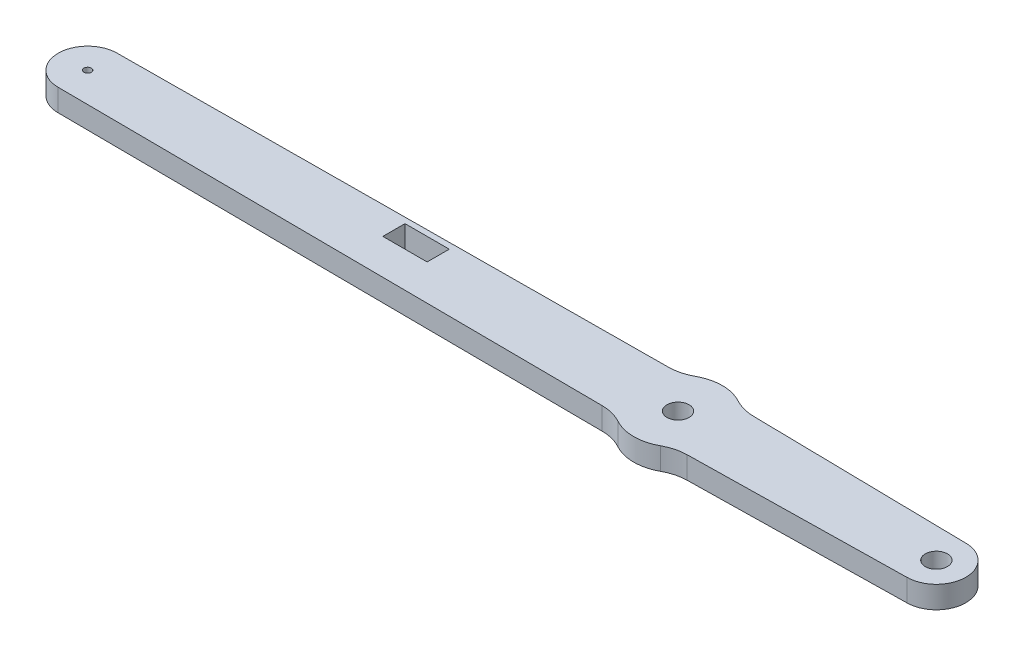
ISO-10303-21;
HEADER;
FILE_DESCRIPTION(('STEP AP214'),'2;1');
FILE_NAME('part.step','',(''),(''),'','','');
FILE_SCHEMA(('AUTOMOTIVE_DESIGN { 1 0 10303 214 1 1 1 1 }'));
ENDSEC;
DATA;
#1=APPLICATION_CONTEXT('core data for automotive mechanical design processes');
#2=APPLICATION_PROTOCOL_DEFINITION('international standard','automotive_design',2000,#1);
#3=PRODUCT_CONTEXT('',#1,'mechanical');
#4=PRODUCT('Part','Part','',(#3));
#5=PRODUCT_RELATED_PRODUCT_CATEGORY('part','',(#4));
#6=PRODUCT_DEFINITION_FORMATION('','',#4);
#7=PRODUCT_DEFINITION_CONTEXT('part definition',#1,'design');
#8=PRODUCT_DEFINITION('design','',#6,#7);
#9=PRODUCT_DEFINITION_SHAPE('','',#8);
#10=(LENGTH_UNIT() NAMED_UNIT(*) SI_UNIT(.MILLI.,.METRE.));
#11=(NAMED_UNIT(*) PLANE_ANGLE_UNIT() SI_UNIT($,.RADIAN.));
#12=(NAMED_UNIT(*) SI_UNIT($,.STERADIAN.) SOLID_ANGLE_UNIT());
#13=UNCERTAINTY_MEASURE_WITH_UNIT(LENGTH_MEASURE(1.E-05),#10,'distance_accuracy_value','');
#14=(GEOMETRIC_REPRESENTATION_CONTEXT(3) GLOBAL_UNCERTAINTY_ASSIGNED_CONTEXT((#13)) GLOBAL_UNIT_ASSIGNED_CONTEXT((#10,
#11,#12)) REPRESENTATION_CONTEXT('',''));
#15=CARTESIAN_POINT('',(0.,0.,0.));
#16=DIRECTION('',(0.,0.,1.));
#17=DIRECTION('',(1.,0.,0.));
#18=AXIS2_PLACEMENT_3D('',#15,#16,#17);
#19=CARTESIAN_POINT('',(41897.2646015626,-392.710765183302,1.50000000000072));
#20=DIRECTION('',(0.,1.,0.));
#21=DIRECTION('',(1.,0.,0.));
#22=AXIS2_PLACEMENT_3D('',#19,#20,#21);
#23=PLANE('',#22);
#24=CARTESIAN_POINT('',(41932.2646015625,-392.710765183302,1.50000000000072));
#25=DIRECTION('',(0.,1.,0.));
#26=DIRECTION('',(1.,0.,0.));
#27=AXIS2_PLACEMENT_3D('',#24,#25,#26);
#28=CIRCLE('',#27,1.50000000000178);
#29=CARTESIAN_POINT('',(41933.7646015625,-392.710765183302,1.50000000000072));
#30=VERTEX_POINT('',#29);
#31=EDGE_CURVE('E519',#30,#30,#28,.T.);
#32=ORIENTED_EDGE('',*,*,#31,.F.);
#33=EDGE_LOOP('',(#32));
#34=FACE_BOUND('',#33,.T.);
#35=DIRECTION('',(1.,0.,0.));
#36=VECTOR('',#35,1.);
#37=CARTESIAN_POINT('',(41856.7646015625,-392.710765183302,0.999999999997059));
#38=LINE('',#37,#36);
#39=CARTESIAN_POINT('',(41856.7646015625,-392.710765183302,0.999999999997059));
#40=VERTEX_POINT('',#39);
#41=CARTESIAN_POINT('',(41862.7646015625,-392.710765183302,0.999999999997059));
#42=VERTEX_POINT('',#41);
#43=EDGE_CURVE('E159',#40,#42,#38,.T.);
#44=ORIENTED_EDGE('',*,*,#43,.F.);
#45=DIRECTION('',(0.,0.,1.));
#46=VECTOR('',#45,1.);
#47=CARTESIAN_POINT('',(41856.7646015625,-392.710765183302,-2.00000000000294));
#48=LINE('',#47,#46);
#49=CARTESIAN_POINT('',(41856.7646015625,-392.710765183302,-2.00000000000294));
#50=VERTEX_POINT('',#49);
#51=EDGE_CURVE('E151',#50,#40,#48,.T.);
#52=ORIENTED_EDGE('',*,*,#51,.F.);
#53=DIRECTION('',(-1.,0.,0.));
#54=VECTOR('',#53,1.);
#55=CARTESIAN_POINT('',(41856.7646015625,-392.710765183302,-2.00000000000294));
#56=LINE('',#55,#54);
#57=CARTESIAN_POINT('',(41862.7646015625,-392.710765183302,-2.00000000000294));
#58=VERTEX_POINT('',#57);
#59=EDGE_CURVE('E174',#58,#50,#56,.T.);
#60=ORIENTED_EDGE('',*,*,#59,.F.);
#61=DIRECTION('',(0.,0.,-1.));
#62=VECTOR('',#61,1.);
#63=CARTESIAN_POINT('',(41862.7646015625,-392.710765183302,-2.00000000000294));
#64=LINE('',#63,#62);
#65=EDGE_CURVE('E172',#42,#58,#64,.T.);
#66=ORIENTED_EDGE('',*,*,#65,.F.);
#67=EDGE_LOOP('',(#44,#52,#60,#66));
#68=FACE_BOUND('',#67,.T.);
#69=CARTESIAN_POINT('',(41897.2646015626,-392.710765183302,1.50000000000072));
#70=DIRECTION('',(0.,1.,0.));
#71=DIRECTION('',(1.,0.,0.));
#72=AXIS2_PLACEMENT_3D('',#69,#70,#71);
#73=CIRCLE('',#72,6.00000000002284);
#74=CARTESIAN_POINT('',(41894.3611674783,-392.710765183302,6.75072095227058));
#75=VERTEX_POINT('',#74);
#76=CARTESIAN_POINT('',(41900.1654397283,-392.710765183302,6.7521555514149));
#77=VERTEX_POINT('',#76);
#78=EDGE_CURVE('E190',#75,#77,#73,.T.);
#79=ORIENTED_EDGE('',*,*,#78,.T.);
#80=CARTESIAN_POINT('',(41903.0662778941,-392.710765183302,12.0043111028106));
#81=DIRECTION('',(0.,-1.,0.));
#82=DIRECTION('',(1.,0.,0.));
#83=AXIS2_PLACEMENT_3D('',#80,#81,#82);
#84=CIRCLE('',#83,6.00000000000439);
#85=CARTESIAN_POINT('',(41902.9628449906,-392.710765183302,6.00520269951249));
#86=VERTEX_POINT('',#85);
#87=EDGE_CURVE('E193',#77,#86,#84,.T.);
#88=ORIENTED_EDGE('',*,*,#87,.T.);
#89=DIRECTION('',(0.999851400548999,0.,-0.017238817250779));
#90=VECTOR('',#89,1.);
#91=CARTESIAN_POINT('',(41932.2646015625,-392.710765183302,5.50000000000089));
#92=LINE('',#91,#90);
#93=CARTESIAN_POINT('',(41932.2646015625,-392.710765183302,5.50000000000089));
#94=VERTEX_POINT('',#93);
#95=EDGE_CURVE('E196',#86,#94,#92,.T.);
#96=ORIENTED_EDGE('',*,*,#95,.T.);
#97=CARTESIAN_POINT('',(41932.2646015625,-392.710765183302,1.50000000000072));
#98=DIRECTION('',(0.,1.,0.));
#99=DIRECTION('',(1.,0.,0.));
#100=AXIS2_PLACEMENT_3D('',#97,#98,#99);
#101=CIRCLE('',#100,4.);
#102=CARTESIAN_POINT('',(41932.2646015625,-392.710765183302,-2.49999999999928));
#103=VERTEX_POINT('',#102);
#104=EDGE_CURVE('E198',#94,#103,#101,.T.);
#105=ORIENTED_EDGE('',*,*,#104,.T.);
#106=DIRECTION('',(-0.999850873758919,0.,-0.0172693440386866));
#107=VECTOR('',#106,1.);
#108=CARTESIAN_POINT('',(41932.2646015625,-392.710765183302,-2.49999999999911));
#109=LINE('',#108,#107);
#110=CARTESIAN_POINT('',(41903.0662778941,-392.710765183302,-3.00431110280153));
#111=VERTEX_POINT('',#110);
#112=EDGE_CURVE('E200',#103,#111,#109,.T.);
#113=ORIENTED_EDGE('',*,*,#112,.T.);
#114=CARTESIAN_POINT('',(41903.0662778941,-392.710765183302,-9.00431110280919));
#115=DIRECTION('',(0.,-1.,0.));
#116=DIRECTION('',(1.,0.,0.));
#117=AXIS2_PLACEMENT_3D('',#114,#115,#116);
#118=CIRCLE('',#117,6.00000000000758);
#119=CARTESIAN_POINT('',(41900.1654397283,-392.710765183302,-3.75215555141006));
#120=VERTEX_POINT('',#119);
#121=EDGE_CURVE('E202',#111,#120,#118,.T.);
#122=ORIENTED_EDGE('',*,*,#121,.T.);
#123=CARTESIAN_POINT('',(41897.2646015626,-392.710765183302,1.50000000000072));
#124=DIRECTION('',(0.,1.,0.));
#125=DIRECTION('',(1.,0.,0.));
#126=AXIS2_PLACEMENT_3D('',#123,#124,#125);
#127=CIRCLE('',#126,6.00000000002433);
#128=CARTESIAN_POINT('',(41894.3611674783,-392.710765183302,-3.75072095226958));
#129=VERTEX_POINT('',#128);
#130=EDGE_CURVE('E204',#120,#129,#127,.T.);
#131=ORIENTED_EDGE('',*,*,#130,.T.);
#132=CARTESIAN_POINT('',(41891.457733394,-392.710765183302,-9.00144190453578));
#133=DIRECTION('',(0.,-1.,0.));
#134=DIRECTION('',(1.,0.,0.));
#135=AXIS2_PLACEMENT_3D('',#132,#133,#134);
#136=CIRCLE('',#135,6.00000000001024);
#137=CARTESIAN_POINT('',(41891.4982730093,-392.710765183302,-3.00157886112223));
#138=VERTEX_POINT('',#137);
#139=EDGE_CURVE('E206',#129,#138,#136,.T.);
#140=ORIENTED_EDGE('',*,*,#139,.T.);
#141=DIRECTION('',(-0.999977173900635,0.,0.00675660252635896));
#142=VECTOR('',#141,1.);
#143=CARTESIAN_POINT('',(41817.2646015625,-392.710765183302,-2.49999999999956));
#144=LINE('',#143,#142);
#145=CARTESIAN_POINT('',(41817.2646015625,-392.710765183302,-2.49999999999956));
#146=VERTEX_POINT('',#145);
#147=EDGE_CURVE('E208',#138,#146,#144,.T.);
#148=ORIENTED_EDGE('',*,*,#147,.T.);
#149=CARTESIAN_POINT('',(41817.2646015626,-392.710765183302,1.50000000000089));
#150=DIRECTION('',(0.,1.,0.));
#151=DIRECTION('',(1.,0.,0.));
#152=AXIS2_PLACEMENT_3D('',#149,#150,#151);
#153=CIRCLE('',#152,4.00000000000006);
#154=CARTESIAN_POINT('',(41817.2646015625,-392.710765183302,5.50000000000095));
#155=VERTEX_POINT('',#154);
#156=EDGE_CURVE('E210',#146,#155,#153,.T.);
#157=ORIENTED_EDGE('',*,*,#156,.T.);
#158=DIRECTION('',(0.999977161426887,0.,0.00675844838898633));
#159=VECTOR('',#158,1.);
#160=CARTESIAN_POINT('',(41891.457733394,-392.710765183302,6.00144190451851));
#161=LINE('',#160,#159);
#162=CARTESIAN_POINT('',(41891.457733394,-392.710765183302,6.00144190451851));
#163=VERTEX_POINT('',#162);
#164=EDGE_CURVE('E212',#155,#163,#161,.T.);
#165=ORIENTED_EDGE('',*,*,#164,.T.);
#166=CARTESIAN_POINT('',(41891.457733394,-392.710765183302,12.0014419045336));
#167=DIRECTION('',(0.,-1.,0.));
#168=DIRECTION('',(1.,0.,0.));
#169=AXIS2_PLACEMENT_3D('',#166,#167,#168);
#170=CIRCLE('',#169,6.00000000001469);
#171=EDGE_CURVE('E214',#163,#75,#170,.T.);
#172=ORIENTED_EDGE('',*,*,#171,.T.);
#173=EDGE_LOOP('',(#79,#88,#96,#105,#113,#122,#131,#140,#148,#157,#165,#172));
#174=FACE_BOUND('',#173,.T.);
#175=CARTESIAN_POINT('',(41817.2646015626,-392.710765183302,1.50000000000089));
#176=DIRECTION('',(0.,1.,0.));
#177=DIRECTION('',(1.,0.,0.));
#178=AXIS2_PLACEMENT_3D('',#175,#176,#177);
#179=CIRCLE('',#178,0.500000000295139);
#180=CARTESIAN_POINT('',(41817.7646015628,-392.710765183302,1.50000000000089));
#181=VERTEX_POINT('',#180);
#182=EDGE_CURVE('E180',#181,#181,#179,.T.);
#183=ORIENTED_EDGE('',*,*,#182,.F.);
#184=EDGE_LOOP('',(#183));
#185=FACE_BOUND('',#184,.T.);
#186=CARTESIAN_POINT('',(41897.2646015626,-392.710765183302,1.50000000000072));
#187=DIRECTION('',(0.,1.,0.));
#188=DIRECTION('',(1.,0.,0.));
#189=AXIS2_PLACEMENT_3D('',#186,#187,#188);
#190=CIRCLE('',#189,1.50000000000178);
#191=CARTESIAN_POINT('',(41898.7646015626,-392.710765183302,1.50000000000072));
#192=VERTEX_POINT('',#191);
#193=EDGE_CURVE('E510',#192,#192,#190,.T.);
#194=ORIENTED_EDGE('',*,*,#193,.F.);
#195=EDGE_LOOP('',(#194));
#196=FACE_BOUND('',#195,.T.);
#197=ADVANCED_FACE('F38',(#34,#68,#174,#185,#196),#23,.T.);
#198=CARTESIAN_POINT('',(41897.2646015626,-395.710765183302,1.50000000000072));
#199=DIRECTION('',(0.,1.,0.));
#200=DIRECTION('',(1.,0.,0.));
#201=AXIS2_PLACEMENT_3D('',#198,#199,#200);
#202=PLANE('',#201);
#203=CARTESIAN_POINT('',(41897.2646015626,-395.710765183302,1.50000000000072));
#204=DIRECTION('',(0.,1.,0.));
#205=DIRECTION('',(1.,0.,0.));
#206=AXIS2_PLACEMENT_3D('',#203,#204,#205);
#207=CIRCLE('',#206,6.00000000002284);
#208=CARTESIAN_POINT('',(41894.3611674783,-395.710765183302,6.75072095227058));
#209=VERTEX_POINT('',#208);
#210=CARTESIAN_POINT('',(41900.1654397283,-395.710765183302,6.7521555514149));
#211=VERTEX_POINT('',#210);
#212=EDGE_CURVE('E167',#209,#211,#207,.T.);
#213=ORIENTED_EDGE('',*,*,#212,.F.);
#214=CARTESIAN_POINT('',(41891.457733394,-395.710765183302,12.0014419045336));
#215=DIRECTION('',(0.,-1.,0.));
#216=DIRECTION('',(1.,0.,0.));
#217=AXIS2_PLACEMENT_3D('',#214,#215,#216);
#218=CIRCLE('',#217,6.00000000001469);
#219=CARTESIAN_POINT('',(41891.457733394,-395.710765183302,6.00144190451851));
#220=VERTEX_POINT('',#219);
#221=EDGE_CURVE('E194',#220,#209,#218,.T.);
#222=ORIENTED_EDGE('',*,*,#221,.F.);
#223=DIRECTION('',(0.999977161426887,0.,0.00675844838898633));
#224=VECTOR('',#223,1.);
#225=CARTESIAN_POINT('',(41891.457733394,-395.710765183302,6.00144190451851));
#226=LINE('',#225,#224);
#227=CARTESIAN_POINT('',(41817.2646015625,-395.710765183302,5.50000000000095));
#228=VERTEX_POINT('',#227);
#229=EDGE_CURVE('E237',#228,#220,#226,.T.);
#230=ORIENTED_EDGE('',*,*,#229,.F.);
#231=CARTESIAN_POINT('',(41817.2646015626,-395.710765183302,1.50000000000089));
#232=DIRECTION('',(0.,1.,0.));
#233=DIRECTION('',(1.,0.,0.));
#234=AXIS2_PLACEMENT_3D('',#231,#232,#233);
#235=CIRCLE('',#234,4.00000000000006);
#236=CARTESIAN_POINT('',(41817.2646015625,-395.710765183302,-2.49999999999956));
#237=VERTEX_POINT('',#236);
#238=EDGE_CURVE('E235',#237,#228,#235,.T.);
#239=ORIENTED_EDGE('',*,*,#238,.F.);
#240=DIRECTION('',(-0.999977173900635,0.,0.00675660252635896));
#241=VECTOR('',#240,1.);
#242=CARTESIAN_POINT('',(41817.2646015625,-395.710765183302,-2.49999999999956));
#243=LINE('',#242,#241);
#244=CARTESIAN_POINT('',(41891.4982730093,-395.710765183302,-3.00157886112223));
#245=VERTEX_POINT('',#244);
#246=EDGE_CURVE('E233',#245,#237,#243,.T.);
#247=ORIENTED_EDGE('',*,*,#246,.F.);
#248=CARTESIAN_POINT('',(41891.457733394,-395.710765183302,-9.00144190453578));
#249=DIRECTION('',(0.,-1.,0.));
#250=DIRECTION('',(1.,0.,0.));
#251=AXIS2_PLACEMENT_3D('',#248,#249,#250);
#252=CIRCLE('',#251,6.00000000001024);
#253=CARTESIAN_POINT('',(41894.3611674783,-395.710765183302,-3.75072095226958));
#254=VERTEX_POINT('',#253);
#255=EDGE_CURVE('E231',#254,#245,#252,.T.);
#256=ORIENTED_EDGE('',*,*,#255,.F.);
#257=CARTESIAN_POINT('',(41897.2646015626,-395.710765183302,1.50000000000072));
#258=DIRECTION('',(0.,1.,0.));
#259=DIRECTION('',(1.,0.,0.));
#260=AXIS2_PLACEMENT_3D('',#257,#258,#259);
#261=CIRCLE('',#260,6.00000000002433);
#262=CARTESIAN_POINT('',(41900.1654397283,-395.710765183302,-3.75215555141006));
#263=VERTEX_POINT('',#262);
#264=EDGE_CURVE('E229',#263,#254,#261,.T.);
#265=ORIENTED_EDGE('',*,*,#264,.F.);
#266=CARTESIAN_POINT('',(41903.0662778941,-395.710765183302,-9.00431110280919));
#267=DIRECTION('',(0.,-1.,0.));
#268=DIRECTION('',(1.,0.,0.));
#269=AXIS2_PLACEMENT_3D('',#266,#267,#268);
#270=CIRCLE('',#269,6.00000000000758);
#271=CARTESIAN_POINT('',(41903.0662778941,-395.710765183302,-3.00431110280153));
#272=VERTEX_POINT('',#271);
#273=EDGE_CURVE('E227',#272,#263,#270,.T.);
#274=ORIENTED_EDGE('',*,*,#273,.F.);
#275=DIRECTION('',(-0.999850873758919,0.,-0.0172693440386866));
#276=VECTOR('',#275,1.);
#277=CARTESIAN_POINT('',(41932.2646015625,-395.710765183302,-2.49999999999911));
#278=LINE('',#277,#276);
#279=CARTESIAN_POINT('',(41932.2646015625,-395.710765183302,-2.49999999999928));
#280=VERTEX_POINT('',#279);
#281=EDGE_CURVE('E225',#280,#272,#278,.T.);
#282=ORIENTED_EDGE('',*,*,#281,.F.);
#283=CARTESIAN_POINT('',(41932.2646015625,-395.710765183302,1.50000000000072));
#284=DIRECTION('',(0.,1.,0.));
#285=DIRECTION('',(1.,0.,0.));
#286=AXIS2_PLACEMENT_3D('',#283,#284,#285);
#287=CIRCLE('',#286,4.);
#288=CARTESIAN_POINT('',(41932.2646015625,-395.710765183302,5.50000000000089));
#289=VERTEX_POINT('',#288);
#290=EDGE_CURVE('E223',#289,#280,#287,.T.);
#291=ORIENTED_EDGE('',*,*,#290,.F.);
#292=DIRECTION('',(0.999851400548999,0.,-0.017238817250779));
#293=VECTOR('',#292,1.);
#294=CARTESIAN_POINT('',(41932.2646015625,-395.710765183302,5.50000000000089));
#295=LINE('',#294,#293);
#296=CARTESIAN_POINT('',(41902.9628449906,-395.710765183302,6.00520269951249));
#297=VERTEX_POINT('',#296);
#298=EDGE_CURVE('E221',#297,#289,#295,.T.);
#299=ORIENTED_EDGE('',*,*,#298,.F.);
#300=CARTESIAN_POINT('',(41903.0662778941,-395.710765183302,12.0043111028106));
#301=DIRECTION('',(0.,-1.,0.));
#302=DIRECTION('',(1.,0.,0.));
#303=AXIS2_PLACEMENT_3D('',#300,#301,#302);
#304=CIRCLE('',#303,6.00000000000439);
#305=EDGE_CURVE('E219',#211,#297,#304,.T.);
#306=ORIENTED_EDGE('',*,*,#305,.F.);
#307=EDGE_LOOP('',(#213,#222,#230,#239,#247,#256,#265,#274,#282,#291,#299,#306));
#308=FACE_BOUND('',#307,.T.);
#309=DIRECTION('',(0.,0.,1.));
#310=VECTOR('',#309,1.);
#311=CARTESIAN_POINT('',(41856.7646015625,-395.710765183302,-2.00000000000294));
#312=LINE('',#311,#310);
#313=CARTESIAN_POINT('',(41856.7646015625,-395.710765183302,-2.00000000000294));
#314=VERTEX_POINT('',#313);
#315=CARTESIAN_POINT('',(41856.7646015625,-395.710765183302,0.999999999997059));
#316=VERTEX_POINT('',#315);
#317=EDGE_CURVE('E61',#314,#316,#312,.T.);
#318=ORIENTED_EDGE('',*,*,#317,.T.);
#319=DIRECTION('',(1.,0.,0.));
#320=VECTOR('',#319,1.);
#321=CARTESIAN_POINT('',(41856.7646015625,-395.710765183302,0.999999999997059));
#322=LINE('',#321,#320);
#323=CARTESIAN_POINT('',(41862.7646015625,-395.710765183302,0.999999999997059));
#324=VERTEX_POINT('',#323);
#325=EDGE_CURVE('E166',#316,#324,#322,.T.);
#326=ORIENTED_EDGE('',*,*,#325,.T.);
#327=DIRECTION('',(0.,0.,-1.));
#328=VECTOR('',#327,1.);
#329=CARTESIAN_POINT('',(41862.7646015625,-395.710765183302,-2.00000000000294));
#330=LINE('',#329,#328);
#331=CARTESIAN_POINT('',(41862.7646015625,-395.710765183302,-2.00000000000294));
#332=VERTEX_POINT('',#331);
#333=EDGE_CURVE('E182',#324,#332,#330,.T.);
#334=ORIENTED_EDGE('',*,*,#333,.T.);
#335=DIRECTION('',(-1.,0.,0.));
#336=VECTOR('',#335,1.);
#337=CARTESIAN_POINT('',(41856.7646015625,-395.710765183302,-2.00000000000294));
#338=LINE('',#337,#336);
#339=EDGE_CURVE('E160',#332,#314,#338,.T.);
#340=ORIENTED_EDGE('',*,*,#339,.T.);
#341=EDGE_LOOP('',(#318,#326,#334,#340));
#342=FACE_BOUND('',#341,.T.);
#343=CARTESIAN_POINT('',(41817.2646015626,-395.710765183302,1.50000000000089));
#344=DIRECTION('',(0.,1.,0.));
#345=DIRECTION('',(1.,0.,0.));
#346=AXIS2_PLACEMENT_3D('',#343,#344,#345);
#347=CIRCLE('',#346,0.500000000295139);
#348=CARTESIAN_POINT('',(41817.7646015628,-395.710765183302,1.50000000000089));
#349=VERTEX_POINT('',#348);
#350=EDGE_CURVE('E522',#349,#349,#347,.T.);
#351=ORIENTED_EDGE('',*,*,#350,.T.);
#352=EDGE_LOOP('',(#351));
#353=FACE_BOUND('',#352,.T.);
#354=CARTESIAN_POINT('',(41932.2646015625,-395.710765183302,1.50000000000072));
#355=DIRECTION('',(0.,1.,0.));
#356=DIRECTION('',(1.,0.,0.));
#357=AXIS2_PLACEMENT_3D('',#354,#355,#356);
#358=CIRCLE('',#357,1.50000000000178);
#359=CARTESIAN_POINT('',(41933.7646015625,-395.710765183302,1.50000000000072));
#360=VERTEX_POINT('',#359);
#361=EDGE_CURVE('E516',#360,#360,#358,.T.);
#362=ORIENTED_EDGE('',*,*,#361,.T.);
#363=EDGE_LOOP('',(#362));
#364=FACE_BOUND('',#363,.T.);
#365=CARTESIAN_POINT('',(41897.2646015626,-395.710765183302,1.50000000000072));
#366=DIRECTION('',(0.,1.,0.));
#367=DIRECTION('',(1.,0.,0.));
#368=AXIS2_PLACEMENT_3D('',#365,#366,#367);
#369=CIRCLE('',#368,1.50000000000178);
#370=CARTESIAN_POINT('',(41898.7646015626,-395.710765183302,1.50000000000072));
#371=VERTEX_POINT('',#370);
#372=EDGE_CURVE('E513',#371,#371,#369,.T.);
#373=ORIENTED_EDGE('',*,*,#372,.T.);
#374=EDGE_LOOP('',(#373));
#375=FACE_BOUND('',#374,.T.);
#376=ADVANCED_FACE('F279',(#308,#342,#353,#364,#375),#202,.F.);
#377=CARTESIAN_POINT('',(41897.2646015626,-392.710765183302,1.50000000000072));
#378=DIRECTION('',(0.,-1.,0.));
#379=DIRECTION('',(-1.,0.,0.));
#380=AXIS2_PLACEMENT_3D('',#377,#378,#379);
#381=CYLINDRICAL_SURFACE('',#380,6.00000000002284);
#382=ORIENTED_EDGE('',*,*,#212,.T.);
#383=DIRECTION('',(0.,-1.,0.));
#384=VECTOR('',#383,1.);
#385=CARTESIAN_POINT('',(41900.1654397283,-392.710765183302,6.7521555514149));
#386=LINE('',#385,#384);
#387=EDGE_CURVE('E11',#77,#211,#386,.T.);
#388=ORIENTED_EDGE('',*,*,#387,.F.);
#389=ORIENTED_EDGE('',*,*,#78,.F.);
#390=DIRECTION('',(0.,-1.,0.));
#391=VECTOR('',#390,1.);
#392=CARTESIAN_POINT('',(41894.3611674783,-392.710765183302,6.75072095227058));
#393=LINE('',#392,#391);
#394=EDGE_CURVE('E216',#75,#209,#393,.T.);
#395=ORIENTED_EDGE('',*,*,#394,.T.);
#396=EDGE_LOOP('',(#382,#388,#389,#395));
#397=FACE_BOUND('',#396,.T.);
#398=ADVANCED_FACE('F40',(#397),#381,.T.);
#399=CARTESIAN_POINT('',(41903.0662778941,-392.710765183302,12.0043111028106));
#400=DIRECTION('',(0.,-1.,0.));
#401=DIRECTION('',(-1.,0.,0.));
#402=AXIS2_PLACEMENT_3D('',#399,#400,#401);
#403=CYLINDRICAL_SURFACE('',#402,6.00000000000439);
#404=ORIENTED_EDGE('',*,*,#305,.T.);
#405=DIRECTION('',(0.,-1.,0.));
#406=VECTOR('',#405,1.);
#407=CARTESIAN_POINT('',(41902.9628449906,-392.710765183302,6.00520269951249));
#408=LINE('',#407,#406);
#409=EDGE_CURVE('E46',#86,#297,#408,.T.);
#410=ORIENTED_EDGE('',*,*,#409,.F.);
#411=ORIENTED_EDGE('',*,*,#87,.F.);
#412=ORIENTED_EDGE('',*,*,#387,.T.);
#413=EDGE_LOOP('',(#404,#410,#411,#412));
#414=FACE_BOUND('',#413,.T.);
#415=ADVANCED_FACE('F296',(#414),#403,.F.);
#416=CARTESIAN_POINT('',(41932.2646015625,-392.710765183302,5.50000000000089));
#417=DIRECTION('',(-0.017238817250779,0.,-0.999851400548999));
#418=DIRECTION('',(-0.999851400548999,0.,0.017238817250779));
#419=AXIS2_PLACEMENT_3D('',#416,#417,#418);
#420=PLANE('',#419);
#421=ORIENTED_EDGE('',*,*,#298,.T.);
#422=DIRECTION('',(0.,-1.,0.));
#423=VECTOR('',#422,1.);
#424=CARTESIAN_POINT('',(41932.2646015625,-392.710765183302,5.50000000000089));
#425=LINE('',#424,#423);
#426=EDGE_CURVE('E266',#94,#289,#425,.T.);
#427=ORIENTED_EDGE('',*,*,#426,.F.);
#428=ORIENTED_EDGE('',*,*,#95,.F.);
#429=ORIENTED_EDGE('',*,*,#409,.T.);
#430=EDGE_LOOP('',(#421,#427,#428,#429));
#431=FACE_BOUND('',#430,.T.);
#432=ADVANCED_FACE('F273',(#431),#420,.F.);
#433=CARTESIAN_POINT('',(41932.2646015625,-392.710765183302,1.50000000000072));
#434=DIRECTION('',(0.,-1.,0.));
#435=DIRECTION('',(-1.,0.,0.));
#436=AXIS2_PLACEMENT_3D('',#433,#434,#435);
#437=CYLINDRICAL_SURFACE('',#436,4.);
#438=ORIENTED_EDGE('',*,*,#290,.T.);
#439=DIRECTION('',(0.,-1.,0.));
#440=VECTOR('',#439,1.);
#441=CARTESIAN_POINT('',(41932.2646015625,-392.710765183302,-2.49999999999928));
#442=LINE('',#441,#440);
#443=EDGE_CURVE('E263',#103,#280,#442,.T.);
#444=ORIENTED_EDGE('',*,*,#443,.F.);
#445=ORIENTED_EDGE('',*,*,#104,.F.);
#446=ORIENTED_EDGE('',*,*,#426,.T.);
#447=EDGE_LOOP('',(#438,#444,#445,#446));
#448=FACE_BOUND('',#447,.T.);
#449=ADVANCED_FACE('F285',(#448),#437,.T.);
#450=CARTESIAN_POINT('',(41932.2646015625,-392.710765183302,-2.49999999999911));
#451=DIRECTION('',(-0.0172693440386866,0.,0.999850873758919));
#452=DIRECTION('',(0.999850873758919,0.,0.0172693440386866));
#453=AXIS2_PLACEMENT_3D('',#450,#451,#452);
#454=PLANE('',#453);
#455=ORIENTED_EDGE('',*,*,#281,.T.);
#456=DIRECTION('',(0.,-1.,0.));
#457=VECTOR('',#456,1.);
#458=CARTESIAN_POINT('',(41903.0662778941,-392.710765183302,-3.00431110280153));
#459=LINE('',#458,#457);
#460=EDGE_CURVE('E260',#111,#272,#459,.T.);
#461=ORIENTED_EDGE('',*,*,#460,.F.);
#462=ORIENTED_EDGE('',*,*,#112,.F.);
#463=ORIENTED_EDGE('',*,*,#443,.T.);
#464=EDGE_LOOP('',(#455,#461,#462,#463));
#465=FACE_BOUND('',#464,.T.);
#466=ADVANCED_FACE('F289',(#465),#454,.F.);
#467=CARTESIAN_POINT('',(41903.0662778941,-392.710765183302,-9.00431110280919));
#468=DIRECTION('',(0.,-1.,0.));
#469=DIRECTION('',(-1.,0.,0.));
#470=AXIS2_PLACEMENT_3D('',#467,#468,#469);
#471=CYLINDRICAL_SURFACE('',#470,6.00000000000758);
#472=ORIENTED_EDGE('',*,*,#273,.T.);
#473=DIRECTION('',(0.,-1.,0.));
#474=VECTOR('',#473,1.);
#475=CARTESIAN_POINT('',(41900.1654397283,-392.710765183302,-3.75215555141006));
#476=LINE('',#475,#474);
#477=EDGE_CURVE('E257',#120,#263,#476,.T.);
#478=ORIENTED_EDGE('',*,*,#477,.F.);
#479=ORIENTED_EDGE('',*,*,#121,.F.);
#480=ORIENTED_EDGE('',*,*,#460,.T.);
#481=EDGE_LOOP('',(#472,#478,#479,#480));
#482=FACE_BOUND('',#481,.T.);
#483=ADVANCED_FACE('F329',(#482),#471,.F.);
#484=CARTESIAN_POINT('',(41897.2646015626,-392.710765183302,1.50000000000072));
#485=DIRECTION('',(0.,-1.,0.));
#486=DIRECTION('',(-1.,0.,0.));
#487=AXIS2_PLACEMENT_3D('',#484,#485,#486);
#488=CYLINDRICAL_SURFACE('',#487,6.00000000002433);
#489=ORIENTED_EDGE('',*,*,#264,.T.);
#490=DIRECTION('',(0.,-1.,0.));
#491=VECTOR('',#490,1.);
#492=CARTESIAN_POINT('',(41894.3611674783,-392.710765183302,-3.75072095226958));
#493=LINE('',#492,#491);
#494=EDGE_CURVE('E254',#129,#254,#493,.T.);
#495=ORIENTED_EDGE('',*,*,#494,.F.);
#496=ORIENTED_EDGE('',*,*,#130,.F.);
#497=ORIENTED_EDGE('',*,*,#477,.T.);
#498=EDGE_LOOP('',(#489,#495,#496,#497));
#499=FACE_BOUND('',#498,.T.);
#500=ADVANCED_FACE('F327',(#499),#488,.T.);
#501=CARTESIAN_POINT('',(41891.457733394,-392.710765183302,-9.00144190453578));
#502=DIRECTION('',(0.,-1.,0.));
#503=DIRECTION('',(-1.,0.,0.));
#504=AXIS2_PLACEMENT_3D('',#501,#502,#503);
#505=CYLINDRICAL_SURFACE('',#504,6.00000000001024);
#506=ORIENTED_EDGE('',*,*,#255,.T.);
#507=DIRECTION('',(0.,-1.,0.));
#508=VECTOR('',#507,1.);
#509=CARTESIAN_POINT('',(41891.4982730093,-392.710765183302,-3.00157886112223));
#510=LINE('',#509,#508);
#511=EDGE_CURVE('E251',#138,#245,#510,.T.);
#512=ORIENTED_EDGE('',*,*,#511,.F.);
#513=ORIENTED_EDGE('',*,*,#139,.F.);
#514=ORIENTED_EDGE('',*,*,#494,.T.);
#515=EDGE_LOOP('',(#506,#512,#513,#514));
#516=FACE_BOUND('',#515,.T.);
#517=ADVANCED_FACE('F323',(#516),#505,.F.);
#518=CARTESIAN_POINT('',(41817.2646015625,-392.710765183302,-2.49999999999956));
#519=DIRECTION('',(0.00675660252635896,0.,0.999977173900635));
#520=DIRECTION('',(0.999977173900635,0.,-0.00675660252635896));
#521=AXIS2_PLACEMENT_3D('',#518,#519,#520);
#522=PLANE('',#521);
#523=ORIENTED_EDGE('',*,*,#246,.T.);
#524=DIRECTION('',(0.,-1.,0.));
#525=VECTOR('',#524,1.);
#526=CARTESIAN_POINT('',(41817.2646015625,-392.710765183302,-2.49999999999956));
#527=LINE('',#526,#525);
#528=EDGE_CURVE('E248',#146,#237,#527,.T.);
#529=ORIENTED_EDGE('',*,*,#528,.F.);
#530=ORIENTED_EDGE('',*,*,#147,.F.);
#531=ORIENTED_EDGE('',*,*,#511,.T.);
#532=EDGE_LOOP('',(#523,#529,#530,#531));
#533=FACE_BOUND('',#532,.T.);
#534=ADVANCED_FACE('F318',(#533),#522,.F.);
#535=CARTESIAN_POINT('',(41817.2646015626,-392.710765183302,1.50000000000089));
#536=DIRECTION('',(0.,-1.,0.));
#537=DIRECTION('',(-1.,0.,0.));
#538=AXIS2_PLACEMENT_3D('',#535,#536,#537);
#539=CYLINDRICAL_SURFACE('',#538,4.00000000000006);
#540=ORIENTED_EDGE('',*,*,#238,.T.);
#541=DIRECTION('',(0.,-1.,0.));
#542=VECTOR('',#541,1.);
#543=CARTESIAN_POINT('',(41817.2646015625,-392.710765183302,5.50000000000095));
#544=LINE('',#543,#542);
#545=EDGE_CURVE('E245',#155,#228,#544,.T.);
#546=ORIENTED_EDGE('',*,*,#545,.F.);
#547=ORIENTED_EDGE('',*,*,#156,.F.);
#548=ORIENTED_EDGE('',*,*,#528,.T.);
#549=EDGE_LOOP('',(#540,#546,#547,#548));
#550=FACE_BOUND('',#549,.T.);
#551=ADVANCED_FACE('F312',(#550),#539,.T.);
#552=CARTESIAN_POINT('',(41891.457733394,-392.710765183302,6.00144190451851));
#553=DIRECTION('',(0.00675844838898633,0.,-0.999977161426886));
#554=DIRECTION('',(-0.999977161426887,0.,-0.00675844838898633));
#555=AXIS2_PLACEMENT_3D('',#552,#553,#554);
#556=PLANE('',#555);
#557=ORIENTED_EDGE('',*,*,#229,.T.);
#558=DIRECTION('',(0.,-1.,0.));
#559=VECTOR('',#558,1.);
#560=CARTESIAN_POINT('',(41891.457733394,-392.710765183302,6.00144190451851));
#561=LINE('',#560,#559);
#562=EDGE_CURVE('E242',#163,#220,#561,.T.);
#563=ORIENTED_EDGE('',*,*,#562,.F.);
#564=ORIENTED_EDGE('',*,*,#164,.F.);
#565=ORIENTED_EDGE('',*,*,#545,.T.);
#566=EDGE_LOOP('',(#557,#563,#564,#565));
#567=FACE_BOUND('',#566,.T.);
#568=ADVANCED_FACE('F308',(#567),#556,.F.);
#569=CARTESIAN_POINT('',(41891.457733394,-392.710765183302,12.0014419045336));
#570=DIRECTION('',(0.,-1.,0.));
#571=DIRECTION('',(-1.,0.,0.));
#572=AXIS2_PLACEMENT_3D('',#569,#570,#571);
#573=CYLINDRICAL_SURFACE('',#572,6.00000000001469);
#574=ORIENTED_EDGE('',*,*,#221,.T.);
#575=ORIENTED_EDGE('',*,*,#394,.F.);
#576=ORIENTED_EDGE('',*,*,#171,.F.);
#577=ORIENTED_EDGE('',*,*,#562,.T.);
#578=EDGE_LOOP('',(#574,#575,#576,#577));
#579=FACE_BOUND('',#578,.T.);
#580=ADVANCED_FACE('F303',(#579),#573,.F.);
#581=CARTESIAN_POINT('',(41856.7646015625,-392.710765183302,-2.00000000000294));
#582=DIRECTION('',(1.,0.,0.));
#583=DIRECTION('',(0.,-1.,0.));
#584=AXIS2_PLACEMENT_3D('',#581,#582,#583);
#585=PLANE('',#584);
#586=ORIENTED_EDGE('',*,*,#317,.F.);
#587=DIRECTION('',(0.,-1.,0.));
#588=VECTOR('',#587,1.);
#589=CARTESIAN_POINT('',(41856.7646015625,-392.710765183302,-2.00000000000294));
#590=LINE('',#589,#588);
#591=EDGE_CURVE('E155',#50,#314,#590,.T.);
#592=ORIENTED_EDGE('',*,*,#591,.F.);
#593=ORIENTED_EDGE('',*,*,#51,.T.);
#594=DIRECTION('',(0.,-1.,0.));
#595=VECTOR('',#594,1.);
#596=CARTESIAN_POINT('',(41856.7646015625,-392.710765183302,0.999999999997059));
#597=LINE('',#596,#595);
#598=EDGE_CURVE('E154',#40,#316,#597,.T.);
#599=ORIENTED_EDGE('',*,*,#598,.T.);
#600=EDGE_LOOP('',(#586,#592,#593,#599));
#601=FACE_BOUND('',#600,.T.);
#602=ADVANCED_FACE('F153',(#601),#585,.T.);
#603=CARTESIAN_POINT('',(41856.7646015625,-392.710765183302,0.999999999997059));
#604=DIRECTION('',(0.,0.,-1.));
#605=DIRECTION('',(0.,1.,0.));
#606=AXIS2_PLACEMENT_3D('',#603,#604,#605);
#607=PLANE('',#606);
#608=ORIENTED_EDGE('',*,*,#325,.F.);
#609=ORIENTED_EDGE('',*,*,#598,.F.);
#610=ORIENTED_EDGE('',*,*,#43,.T.);
#611=DIRECTION('',(0.,-1.,0.));
#612=VECTOR('',#611,1.);
#613=CARTESIAN_POINT('',(41862.7646015625,-392.710765183302,0.999999999997059));
#614=LINE('',#613,#612);
#615=EDGE_CURVE('E168',#42,#324,#614,.T.);
#616=ORIENTED_EDGE('',*,*,#615,.T.);
#617=EDGE_LOOP('',(#608,#609,#610,#616));
#618=FACE_BOUND('',#617,.T.);
#619=ADVANCED_FACE('F163',(#618),#607,.T.);
#620=CARTESIAN_POINT('',(41862.7646015625,-392.710765183302,-2.00000000000294));
#621=DIRECTION('',(-1.,0.,0.));
#622=DIRECTION('',(0.,1.,0.));
#623=AXIS2_PLACEMENT_3D('',#620,#621,#622);
#624=PLANE('',#623);
#625=ORIENTED_EDGE('',*,*,#333,.F.);
#626=ORIENTED_EDGE('',*,*,#615,.F.);
#627=ORIENTED_EDGE('',*,*,#65,.T.);
#628=DIRECTION('',(0.,-1.,0.));
#629=VECTOR('',#628,1.);
#630=CARTESIAN_POINT('',(41862.7646015625,-392.710765183302,-2.00000000000294));
#631=LINE('',#630,#629);
#632=EDGE_CURVE('E53',#58,#332,#631,.T.);
#633=ORIENTED_EDGE('',*,*,#632,.T.);
#634=EDGE_LOOP('',(#625,#626,#627,#633));
#635=FACE_BOUND('',#634,.T.);
#636=ADVANCED_FACE('F389',(#635),#624,.T.);
#637=CARTESIAN_POINT('',(41856.7646015625,-392.710765183302,-2.00000000000294));
#638=DIRECTION('',(0.,0.,1.));
#639=DIRECTION('',(0.,-1.,0.));
#640=AXIS2_PLACEMENT_3D('',#637,#638,#639);
#641=PLANE('',#640);
#642=ORIENTED_EDGE('',*,*,#339,.F.);
#643=ORIENTED_EDGE('',*,*,#632,.F.);
#644=ORIENTED_EDGE('',*,*,#59,.T.);
#645=ORIENTED_EDGE('',*,*,#591,.T.);
#646=EDGE_LOOP('',(#642,#643,#644,#645));
#647=FACE_BOUND('',#646,.T.);
#648=ADVANCED_FACE('F395',(#647),#641,.T.);
#649=CARTESIAN_POINT('',(41817.2646015626,-392.710765183302,1.50000000000089));
#650=DIRECTION('',(0.,-1.,0.));
#651=DIRECTION('',(-1.,0.,0.));
#652=AXIS2_PLACEMENT_3D('',#649,#650,#651);
#653=CYLINDRICAL_SURFACE('',#652,0.500000000295139);
#654=ORIENTED_EDGE('',*,*,#182,.T.);
#655=EDGE_LOOP('',(#654));
#656=FACE_BOUND('',#655,.T.);
#657=ORIENTED_EDGE('',*,*,#350,.F.);
#658=EDGE_LOOP('',(#657));
#659=FACE_BOUND('',#658,.T.);
#660=ADVANCED_FACE('F403',(#656,#659),#653,.F.);
#661=CARTESIAN_POINT('',(41932.2646015625,-392.710765183302,1.50000000000072));
#662=DIRECTION('',(0.,-1.,0.));
#663=DIRECTION('',(-1.,0.,0.));
#664=AXIS2_PLACEMENT_3D('',#661,#662,#663);
#665=CYLINDRICAL_SURFACE('',#664,1.50000000000178);
#666=ORIENTED_EDGE('',*,*,#31,.T.);
#667=EDGE_LOOP('',(#666));
#668=FACE_BOUND('',#667,.T.);
#669=ORIENTED_EDGE('',*,*,#361,.F.);
#670=EDGE_LOOP('',(#669));
#671=FACE_BOUND('',#670,.T.);
#672=ADVANCED_FACE('F410',(#668,#671),#665,.F.);
#673=CARTESIAN_POINT('',(41897.2646015626,-392.710765183302,1.50000000000072));
#674=DIRECTION('',(0.,-1.,0.));
#675=DIRECTION('',(-1.,0.,0.));
#676=AXIS2_PLACEMENT_3D('',#673,#674,#675);
#677=CYLINDRICAL_SURFACE('',#676,1.50000000000178);
#678=ORIENTED_EDGE('',*,*,#193,.T.);
#679=EDGE_LOOP('',(#678));
#680=FACE_BOUND('',#679,.T.);
#681=ORIENTED_EDGE('',*,*,#372,.F.);
#682=EDGE_LOOP('',(#681));
#683=FACE_BOUND('',#682,.T.);
#684=ADVANCED_FACE('F418',(#680,#683),#677,.F.);
#685=CLOSED_SHELL('',(#197,#376,#398,#415,#432,#449,#466,#483,#500,#517,#534,#551,#568,#580,
#602,#619,#636,#648,#660,#672,#684));
#686=MANIFOLD_SOLID_BREP('B2',#685);
#687=ADVANCED_BREP_SHAPE_REPRESENTATION('',(#18,#686),#14);
#688=SHAPE_DEFINITION_REPRESENTATION(#9,#687);
ENDSEC;
END-ISO-10303-21;
